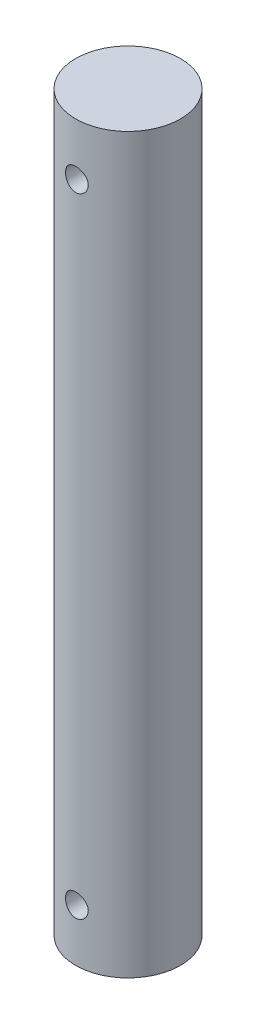
ISO-10303-21;
HEADER;
FILE_DESCRIPTION(('STEP AP214'),'2;1');
FILE_NAME('part.step','',(''),(''),'','','');
FILE_SCHEMA(('AUTOMOTIVE_DESIGN { 1 0 10303 214 1 1 1 1 }'));
ENDSEC;
DATA;
#1=APPLICATION_CONTEXT('core data for automotive mechanical design processes');
#2=APPLICATION_PROTOCOL_DEFINITION('international standard','automotive_design',2000,#1);
#3=PRODUCT_CONTEXT('',#1,'mechanical');
#4=PRODUCT('Part','Part','',(#3));
#5=PRODUCT_RELATED_PRODUCT_CATEGORY('part','',(#4));
#6=PRODUCT_DEFINITION_FORMATION('','',#4);
#7=PRODUCT_DEFINITION_CONTEXT('part definition',#1,'design');
#8=PRODUCT_DEFINITION('design','',#6,#7);
#9=PRODUCT_DEFINITION_SHAPE('','',#8);
#10=(LENGTH_UNIT() NAMED_UNIT(*) SI_UNIT(.MILLI.,.METRE.));
#11=(NAMED_UNIT(*) PLANE_ANGLE_UNIT() SI_UNIT($,.RADIAN.));
#12=(NAMED_UNIT(*) SI_UNIT($,.STERADIAN.) SOLID_ANGLE_UNIT());
#13=UNCERTAINTY_MEASURE_WITH_UNIT(LENGTH_MEASURE(1.E-05),#10,'distance_accuracy_value','');
#14=(GEOMETRIC_REPRESENTATION_CONTEXT(3) GLOBAL_UNCERTAINTY_ASSIGNED_CONTEXT((#13)) GLOBAL_UNIT_ASSIGNED_CONTEXT((#10,
#11,#12)) REPRESENTATION_CONTEXT('',''));
#15=CARTESIAN_POINT('',(0.,0.,0.));
#16=DIRECTION('',(0.,0.,1.));
#17=DIRECTION('',(1.,0.,0.));
#18=AXIS2_PLACEMENT_3D('',#15,#16,#17);
#19=CARTESIAN_POINT('',(0.,0.,0.));
#20=DIRECTION('',(0.,-1.,0.));
#21=DIRECTION('',(0.,0.,-1.));
#22=AXIS2_PLACEMENT_3D('',#19,#20,#21);
#23=CYLINDRICAL_SURFACE('',#22,15.);
#24=CARTESIAN_POINT('',(0.,198.25,-15.));
#25=CARTESIAN_POINT('',(-0.180295908049448,198.249993784621,-14.9999966693057));
#26=CARTESIAN_POINT('',(-0.360667307049298,198.234946290807,-14.9967162684783));
#27=CARTESIAN_POINT('',(-0.716289565823278,198.175214701707,-14.9839468995945));
#28=CARTESIAN_POINT('',(-0.891536624010413,198.130509158674,-14.9744534385199));
#29=CARTESIAN_POINT('',(-1.23171906209388,198.012925168686,-14.9503153207334));
#30=CARTESIAN_POINT('',(-1.39666490753509,197.940075873709,-14.9356759956412));
#31=CARTESIAN_POINT('',(-1.71198631079314,197.768364158581,-14.9028274454145));
#32=CARTESIAN_POINT('',(-1.86236230084291,197.669502510443,-14.8846183262309));
#33=CARTESIAN_POINT('',(-2.14665208154906,197.446923003415,-14.8463051127686));
#34=CARTESIAN_POINT('',(-2.28030331937103,197.322873751652,-14.8261778835102));
#35=CARTESIAN_POINT('',(-2.52507351676009,197.054151889517,-14.7864605245003));
#36=CARTESIAN_POINT('',(-2.63619049708834,196.909477469485,-14.7668704420584));
#37=CARTESIAN_POINT('',(-2.83389172171801,196.601676791658,-14.7302175916099));
#38=CARTESIAN_POINT('',(-2.92019732981498,196.438367718132,-14.7131844826828));
#39=CARTESIAN_POINT('',(-3.06403885746017,196.099134450798,-14.6839058035849));
#40=CARTESIAN_POINT('',(-3.12157814775265,195.92321173778,-14.6716596725283));
#41=CARTESIAN_POINT('',(-3.20538774577177,195.566590450354,-14.6535769412305));
#42=CARTESIAN_POINT('',(-3.23212243576156,195.386005934341,-14.6476452571684));
#43=CARTESIAN_POINT('',(-3.25500769755932,195.022824880646,-14.6425773884666));
#44=CARTESIAN_POINT('',(-3.25116195572919,194.840228588125,-14.6434403847524));
#45=CARTESIAN_POINT('',(-3.21336942802685,194.481653251494,-14.6517782488981));
#46=CARTESIAN_POINT('',(-3.17996128945998,194.305614268404,-14.659134793886));
#47=CARTESIAN_POINT('',(-3.08484532446007,193.961700506059,-14.6794438722465));
#48=CARTESIAN_POINT('',(-3.02313593703792,193.793826177702,-14.6923967142872));
#49=CARTESIAN_POINT('',(-2.87267234160868,193.469488465532,-14.7225560243955));
#50=CARTESIAN_POINT('',(-2.78371029025397,193.313124649328,-14.739794983375));
#51=CARTESIAN_POINT('',(-2.58141287347627,193.017344939241,-14.7765640984072));
#52=CARTESIAN_POINT('',(-2.4680742447044,192.877931318434,-14.7960945610695));
#53=CARTESIAN_POINT('',(-2.21738589401456,192.616907475027,-14.835754332158));
#54=CARTESIAN_POINT('',(-2.07957794577936,192.495737503128,-14.85588755679));
#55=CARTESIAN_POINT('',(-1.7853706879587,192.278157632006,-14.8941069317091));
#56=CARTESIAN_POINT('',(-1.6289710538129,192.181748165128,-14.9121930462485));
#57=CARTESIAN_POINT('',(-1.3014881897179,192.016320368726,-14.9443373716602));
#58=CARTESIAN_POINT('',(-1.13037536900717,191.947358886443,-14.9583872064739));
#59=CARTESIAN_POINT('',(-0.778618718560527,191.839289234188,-14.9808135442155));
#60=CARTESIAN_POINT('',(-0.597976252163955,191.800176806238,-14.9891908563114));
#61=CARTESIAN_POINT('',(-0.2360652110289,191.753553913845,-14.999213361495));
#62=CARTESIAN_POINT('',(-0.0548775718096582,191.745441938139,-15.0009866764124));
#63=CARTESIAN_POINT('',(0.306263892778617,191.759421041123,-14.9979600537354));
#64=CARTESIAN_POINT('',(0.486217799382512,191.781510111658,-14.9931605531864));
#65=CARTESIAN_POINT('',(0.837796559168634,191.854765383555,-14.9776083561987));
#66=CARTESIAN_POINT('',(1.00949009057104,191.905616871482,-14.9669201255134));
#67=CARTESIAN_POINT('',(1.34191087470412,192.034604790844,-14.9407864650998));
#68=CARTESIAN_POINT('',(1.50263720396353,192.112743516564,-14.9253406353698));
#69=CARTESIAN_POINT('',(1.81105407007216,192.295346575048,-14.8910886543747));
#70=CARTESIAN_POINT('',(1.9585297850952,192.400165276922,-14.8722383494472));
#71=CARTESIAN_POINT('',(2.23401442977502,192.632685338536,-14.8333599953618));
#72=CARTESIAN_POINT('',(2.36202087803886,192.760389610573,-14.8133317965295));
#73=CARTESIAN_POINT('',(2.59730506366785,193.037813561719,-14.7739136304381));
#74=CARTESIAN_POINT('',(2.70416667406636,193.187889197169,-14.7545417229379));
#75=CARTESIAN_POINT('',(2.89117048723926,193.504210856978,-14.7190430959262));
#76=CARTESIAN_POINT('',(2.97131383846081,193.670456185909,-14.7029162369426));
#77=CARTESIAN_POINT('',(3.1020701832625,194.013511070582,-14.6758857522881));
#78=CARTESIAN_POINT('',(3.15284800405868,194.190255397078,-14.6649530352252));
#79=CARTESIAN_POINT('',(3.22391689783528,194.550034561049,-14.6494951003857));
#80=CARTESIAN_POINT('',(3.24421274100597,194.733068409678,-14.6449688800489));
#81=CARTESIAN_POINT('',(3.25354151060672,195.096037370382,-14.6428987441684));
#82=CARTESIAN_POINT('',(3.24323395356437,195.275955006757,-14.6452075281965));
#83=CARTESIAN_POINT('',(3.19312076993412,195.631424667548,-14.6562145868373));
#84=CARTESIAN_POINT('',(3.1533154775375,195.806976741401,-14.6649127890618));
#85=CARTESIAN_POINT('',(3.04565266388731,196.148219999221,-14.6876474775607));
#86=CARTESIAN_POINT('',(2.97788940663082,196.313942198673,-14.7016660130169));
#87=CARTESIAN_POINT('',(2.81631583767424,196.631764098396,-14.7334692103237));
#88=CARTESIAN_POINT('',(2.72250287117638,196.783862408127,-14.7512542559859));
#89=CARTESIAN_POINT('',(2.50929797419179,197.073373956119,-14.7890277865734));
#90=CARTESIAN_POINT('',(2.38943530184154,197.210435799835,-14.809052999583));
#91=CARTESIAN_POINT('',(2.12848952985281,197.462716799502,-14.8488018655154));
#92=CARTESIAN_POINT('',(1.98740153607882,197.577930903915,-14.8685254477296));
#93=CARTESIAN_POINT('',(1.68585522677997,197.78464218421,-14.905745119116));
#94=CARTESIAN_POINT('',(1.52517402330616,197.875820178016,-14.9232097999439));
#95=CARTESIAN_POINT('',(1.19042388194525,198.029730439531,-14.9536295276971));
#96=CARTESIAN_POINT('',(1.01636641468493,198.092486768376,-14.9665883869811));
#97=CARTESIAN_POINT('',(0.701757838379086,198.176476440887,-14.9842005952921));
#98=CARTESIAN_POINT('',(0.562919481911555,198.203995568961,-14.9900889074932));
#99=CARTESIAN_POINT('',(0.282736154267477,198.240759394974,-14.9979898329921));
#100=CARTESIAN_POINT('',(0.141391290518709,198.250004874212,-15.0000026119903));
#101=CARTESIAN_POINT('',(0.,198.25,-15.));
#102=B_SPLINE_CURVE_WITH_KNOTS('',3,(#24,#25,#26,#27,#28,#29,#30,#31,#32,#33,#34,#35,#36,#37,
#38,#39,#40,#41,#42,#43,#44,#45,#46,#47,#48,#49,#50,#51,#52,#53,#54,#55,#56,#57,#58,#59,#60,#61,
#62,#63,#64,#65,#66,#67,#68,#69,#70,#71,#72,#73,#74,#75,#76,#77,#78,#79,#80,#81,#82,#83,#84,#85,
#86,#87,#88,#89,#90,#91,#92,#93,#94,#95,#96,#97,#98,#99,#100,#101),.UNSPECIFIED.,.T.,.F.,(4,2,2,
2,2,2,2,2,2,2,2,2,2,2,2,2,2,2,2,2,2,2,2,2,2,2,2,2,2,2,2,2,2,2,2,2,2,2,4),(0.,0.540370209495572,
1.08113162395274,1.62133440005141,2.16152114545112,2.7093386000599,3.25720414999318,
3.81100133249794,4.36473360761809,4.91000435837714,5.45520937968999,5.99068035786525,
6.5261808741332,7.06587160249394,7.60563462552349,8.15684427994945,8.70806355841292,
9.26041859404906,9.81269482130974,10.3541989908452,10.8956671559495,11.4313222043121,
11.9670223009176,12.5102471881152,13.0535412523857,13.606647537556,14.1597300451566,
14.7096772201886,15.2595383238331,15.7976362931293,16.3357281661981,16.8720204277009,
17.408367364301,17.9553599003686,18.5024787558608,19.0565335795928,19.6101184722971,
20.033904619159,20.4576726464261),.UNSPECIFIED.);
#103=CARTESIAN_POINT('',(0.,198.25,-15.));
#104=VERTEX_POINT('',#103);
#105=EDGE_CURVE('E50',#104,#104,#102,.T.);
#106=ORIENTED_EDGE('',*,*,#105,.T.);
#107=EDGE_LOOP('',(#106));
#108=FACE_BOUND('',#107,.T.);
#109=CARTESIAN_POINT('',(3.25,195.,14.6436846456075));
#110=CARTESIAN_POINT('',(3.24999374418569,194.819760088784,14.6436882875398));
#111=CARTESIAN_POINT('',(3.23495527856303,194.63944458552,14.6470485721587));
#112=CARTESIAN_POINT('',(3.1752627965198,194.283938357536,14.6601025036353));
#113=CARTESIAN_POINT('',(3.13058710870242,194.108751480931,14.6698007849001));
#114=CARTESIAN_POINT('',(3.01309038926967,193.768696553366,14.6943819358565));
#115=CARTESIAN_POINT('',(2.94029990891101,193.603817526453,14.7092591760476));
#116=CARTESIAN_POINT('',(2.76872687046993,193.288608945559,14.7425151888116));
#117=CARTESIAN_POINT('',(2.66994495139821,193.138279034006,14.7608938752969));
#118=CARTESIAN_POINT('',(2.44744749965638,192.853940839162,14.7994223656265));
#119=CARTESIAN_POINT('',(2.32338265230344,192.72020887168,14.8195944640893));
#120=CARTESIAN_POINT('',(2.05459524161824,192.475281833832,14.8592415907077));
#121=CARTESIAN_POINT('',(1.90987109259749,192.364088494987,14.8787165652125));
#122=CARTESIAN_POINT('',(1.60202327034842,192.16630444832,14.9150176708326));
#123=CARTESIAN_POINT('',(1.4387253220784,192.079979142488,14.9318144302608));
#124=CARTESIAN_POINT('',(1.09951606220902,191.936098174415,14.9606148904119));
#125=CARTESIAN_POINT('',(0.923606141450511,191.878539345388,14.9726191186962));
#126=CARTESIAN_POINT('',(0.567038811589573,191.794693257701,14.9903244226033));
#127=CARTESIAN_POINT('',(0.386496095207174,191.767938466318,14.9961196396371));
#128=CARTESIAN_POINT('',(0.0233979815583357,191.744998496565,15.0010800104915));
#129=CARTESIAN_POINT('',(-0.159157187294291,191.748809883883,15.0002459091595));
#130=CARTESIAN_POINT('',(-0.517876282975206,191.786545141564,14.9921136856068));
#131=CARTESIAN_POINT('',(-0.69409603036072,191.819965108907,14.9849237369129));
#132=CARTESIAN_POINT('',(-1.03836507975621,191.91516629691,14.9650107956937));
#133=CARTESIAN_POINT('',(-1.20641401655309,191.976948784013,14.9522875560976));
#134=CARTESIAN_POINT('',(-1.53097439172053,192.127569352293,14.9225631793824));
#135=CARTESIAN_POINT('',(-1.68739397454787,192.216599169469,14.9055318792963));
#136=CARTESIAN_POINT('',(-1.98325708864248,192.419044319751,14.8690599867316));
#137=CARTESIAN_POINT('',(-2.12269834391616,192.532462916618,14.8496190719406));
#138=CARTESIAN_POINT('',(-2.38364280420854,192.78321187461,14.8099982184546));
#139=CARTESIAN_POINT('',(-2.50472152387351,192.920983259141,14.7898112954025));
#140=CARTESIAN_POINT('',(-2.72213417758256,193.215083579408,14.751346087027));
#141=CARTESIAN_POINT('',(-2.81846746606027,193.371412999135,14.7330678515052));
#142=CARTESIAN_POINT('',(-2.98383849279335,193.698869301842,14.7004716199645));
#143=CARTESIAN_POINT('',(-3.05279732493626,193.870037253251,14.6861651074568));
#144=CARTESIAN_POINT('',(-3.16084516369863,194.22191478425,14.6632922486876));
#145=CARTESIAN_POINT('',(-3.19993881050222,194.402622876913,14.6547250107347));
#146=CARTESIAN_POINT('',(-3.24649087294647,194.764575930912,14.6444822196297));
#147=CARTESIAN_POINT('',(-3.25456679164568,194.945737759039,14.6426721647475));
#148=CARTESIAN_POINT('',(-3.24052481285367,195.30681926365,14.6457860597559));
#149=CARTESIAN_POINT('',(-3.21840894767304,195.486739022922,14.6507095563884));
#150=CARTESIAN_POINT('',(-3.14514656813775,195.838087520737,14.6666089084925));
#151=CARTESIAN_POINT('',(-3.09433900332005,196.009590430739,14.6775140573003));
#152=CARTESIAN_POINT('',(-2.96550194274915,196.341649180575,14.7040843972367));
#153=CARTESIAN_POINT('',(-2.88746988175918,196.502203987116,14.7197500369061));
#154=CARTESIAN_POINT('',(-2.70503415943233,196.810484620301,14.7543725034408));
#155=CARTESIAN_POINT('',(-2.60024942185828,196.95797963734,14.7733755324212));
#156=CARTESIAN_POINT('',(-2.36778249296566,197.233518769565,14.8124092112065));
#157=CARTESIAN_POINT('',(-2.24009751407035,197.361560513254,14.8324399859035));
#158=CARTESIAN_POINT('',(-1.96266282739553,197.596948950887,14.8717147831235));
#159=CARTESIAN_POINT('',(-1.81255277825355,197.703875041457,14.8909377595947));
#160=CARTESIAN_POINT('',(-1.49614237446866,197.890991926299,14.9260462662687));
#161=CARTESIAN_POINT('',(-1.3298427686606,197.971183956374,14.941931950728));
#162=CARTESIAN_POINT('',(-0.986799845054551,198.101967485345,14.9684871127288));
#163=CARTESIAN_POINT('',(-0.81012987618583,198.152744455288,14.9791892026722));
#164=CARTESIAN_POINT('',(-0.450509790668171,198.223836731634,14.9943122217838));
#165=CARTESIAN_POINT('',(-0.267560572750787,198.244156378865,14.9987340460212));
#166=CARTESIAN_POINT('',(0.0954291307323043,198.25356510789,15.0007723542807));
#167=CARTESIAN_POINT('',(0.275452845637323,198.243282654458,14.9985257872796));
#168=CARTESIAN_POINT('',(0.631141434245107,198.193182742926,14.9877725306642));
#169=CARTESIAN_POINT('',(0.806806383405669,198.153365796489,14.9792659494998));
#170=CARTESIAN_POINT('',(1.14831560036396,198.045625919775,14.9569578961947));
#171=CARTESIAN_POINT('',(1.31418864994873,197.977790584521,14.9431729357756));
#172=CARTESIAN_POINT('',(1.63228292912195,197.816025535732,14.9117815148407));
#173=CARTESIAN_POINT('',(1.78450285868517,197.722093340785,14.8941746909588));
#174=CARTESIAN_POINT('',(2.07404033052225,197.508743638425,14.8566513945941));
#175=CARTESIAN_POINT('',(2.21102679757487,197.388883287877,14.8366979551395));
#176=CARTESIAN_POINT('',(2.46315681458146,197.127974863729,14.7969317175724));
#177=CARTESIAN_POINT('',(2.57829510398268,196.986921701984,14.7771189544342));
#178=CARTESIAN_POINT('',(2.78490749954038,196.685415910371,14.7395892040315));
#179=CARTESIAN_POINT('',(2.87605278058932,196.524733903933,14.721902979916));
#180=CARTESIAN_POINT('',(3.02990167278536,196.189985616612,14.691014282851));
#181=CARTESIAN_POINT('',(3.09262955452639,196.015930906209,14.6778079861381));
#182=CARTESIAN_POINT('',(3.17655313266695,195.7013942379,14.6598384420898));
#183=CARTESIAN_POINT('',(3.20404329920648,195.562629072153,14.6538206642654));
#184=CARTESIAN_POINT('',(3.24076875699929,195.282591349023,14.6457424311338));
#185=CARTESIAN_POINT('',(3.25000490493393,195.141318909622,14.6436817901139));
#186=CARTESIAN_POINT('',(3.25,195.,14.6436846456075));
#187=B_SPLINE_CURVE_WITH_KNOTS('',3,(#109,#110,#111,#112,#113,#114,#115,#116,#117,#118,#119,
#120,#121,#122,#123,#124,#125,#126,#127,#128,#129,#130,#131,#132,#133,#134,#135,#136,#137,#138,
#139,#140,#141,#142,#143,#144,#145,#146,#147,#148,#149,#150,#151,#152,#153,#154,#155,#156,#157,
#158,#159,#160,#161,#162,#163,#164,#165,#166,#167,#168,#169,#170,#171,#172,#173,#174,#175,#176,
#177,#178,#179,#180,#181,#182,#183,#184,#185,#186),.UNSPECIFIED.,.T.,.F.,(4,2,2,2,2,2,2,2,2,2,2,
2,2,2,2,2,2,2,2,2,2,2,2,2,2,2,2,2,2,2,2,2,2,2,2,2,2,2,4),(0.,0.540201867279167,1.08079917823533,
1.62081068828917,2.16080892316839,2.70884661020496,3.25692638408379,3.81065542264333,
4.36432348994259,4.90947255414443,5.45456036813802,5.99054590788528,6.5265553827517,
7.06642696356627,7.60637083622473,8.15734142868398,8.70832639357308,9.26088822158566,
9.81336418003639,10.3547826108844,10.8961645988328,11.4312808842156,11.9664476047232,
12.5097099886453,13.0530385471842,13.6062886945075,14.1595132638403,14.7092105093708,
15.258829403681,15.7972393725394,16.3356400140747,16.8723700217382,17.409151081722,
17.9559483293249,18.5028770668873,19.0569514102052,19.6105516361109,20.0341222057674,
20.4576728963144),.UNSPECIFIED.);
#188=CARTESIAN_POINT('',(3.25,195.,14.6436846456075));
#189=VERTEX_POINT('',#188);
#190=EDGE_CURVE('E54',#189,#189,#187,.T.);
#191=ORIENTED_EDGE('',*,*,#190,.T.);
#192=EDGE_LOOP('',(#191));
#193=FACE_BOUND('',#192,.T.);
#194=CARTESIAN_POINT('',(0.,0.,0.));
#195=DIRECTION('',(0.,-1.,0.));
#196=DIRECTION('',(0.,0.,-1.));
#197=AXIS2_PLACEMENT_3D('',#194,#195,#196);
#198=CIRCLE('',#197,15.);
#199=CARTESIAN_POINT('',(0.,0.,-15.));
#200=VERTEX_POINT('',#199);
#201=EDGE_CURVE('E84',#200,#200,#198,.T.);
#202=ORIENTED_EDGE('',*,*,#201,.F.);
#203=EDGE_LOOP('',(#202));
#204=FACE_BOUND('',#203,.T.);
#205=CARTESIAN_POINT('',(0.,210.,0.));
#206=DIRECTION('',(0.,-1.,0.));
#207=DIRECTION('',(0.,0.,-1.));
#208=AXIS2_PLACEMENT_3D('',#205,#206,#207);
#209=CIRCLE('',#208,15.);
#210=CARTESIAN_POINT('',(0.,210.,-15.));
#211=VERTEX_POINT('',#210);
#212=EDGE_CURVE('E81',#211,#211,#209,.T.);
#213=ORIENTED_EDGE('',*,*,#212,.T.);
#214=EDGE_LOOP('',(#213));
#215=FACE_BOUND('',#214,.T.);
#216=CARTESIAN_POINT('',(3.25,15.,14.6436846456075));
#217=CARTESIAN_POINT('',(3.24999374418569,15.1802399112158,14.6436882875398));
#218=CARTESIAN_POINT('',(3.23495527856303,15.3605554144799,14.6470485721587));
#219=CARTESIAN_POINT('',(3.1752627965198,15.7160616424636,14.6601025036353));
#220=CARTESIAN_POINT('',(3.13058710870242,15.8912485190693,14.6698007849001));
#221=CARTESIAN_POINT('',(3.01309038926967,16.2313034466338,14.6943819358565));
#222=CARTESIAN_POINT('',(2.940299908911,16.3961824735471,14.7092591760476));
#223=CARTESIAN_POINT('',(2.76872687046992,16.7113910544414,14.7425151888116));
#224=CARTESIAN_POINT('',(2.6699449513982,16.8617209659944,14.7608938752969));
#225=CARTESIAN_POINT('',(2.44744749965638,17.1460591608377,14.7994223656265));
#226=CARTESIAN_POINT('',(2.32338265230344,17.2797911283198,14.8195944640893));
#227=CARTESIAN_POINT('',(2.05459524161824,17.5247181661683,14.8592415907077));
#228=CARTESIAN_POINT('',(1.9098710925975,17.6359115050131,14.8787165652125));
#229=CARTESIAN_POINT('',(1.60202327034843,17.8336955516798,14.9150176708326));
#230=CARTESIAN_POINT('',(1.43872532207842,17.9200208575121,14.9318144302608));
#231=CARTESIAN_POINT('',(1.09951606220903,18.0639018255847,14.9606148904119));
#232=CARTESIAN_POINT('',(0.923606141450512,18.1214606546119,14.9726191186962));
#233=CARTESIAN_POINT('',(0.56703881158957,18.2053067422992,14.9903244226033));
#234=CARTESIAN_POINT('',(0.386496095207174,18.2320615336815,14.9961196396371));
#235=CARTESIAN_POINT('',(0.023397981558342,18.2550015034354,15.0010800104915));
#236=CARTESIAN_POINT('',(-0.159157187294282,18.2511901161174,15.0002459091595));
#237=CARTESIAN_POINT('',(-0.517876282975195,18.213454858436,14.9921136856068));
#238=CARTESIAN_POINT('',(-0.694096030360709,18.1800348910935,14.9849237369129));
#239=CARTESIAN_POINT('',(-1.0383650797562,18.0848337030898,14.9650107956937));
#240=CARTESIAN_POINT('',(-1.20641401655308,18.0230512159872,14.9522875560976));
#241=CARTESIAN_POINT('',(-1.53097439172052,17.8724306477073,14.9225631793824));
#242=CARTESIAN_POINT('',(-1.68739397454786,17.7834008305314,14.9055318792963));
#243=CARTESIAN_POINT('',(-1.98325708864247,17.5809556802493,14.8690599867316));
#244=CARTESIAN_POINT('',(-2.12269834391615,17.4675370833815,14.8496190719406));
#245=CARTESIAN_POINT('',(-2.38364280420854,17.2167881253904,14.8099982184546));
#246=CARTESIAN_POINT('',(-2.50472152387351,17.0790167408589,14.7898112954025));
#247=CARTESIAN_POINT('',(-2.72213417758256,16.784916420592,14.751346087027));
#248=CARTESIAN_POINT('',(-2.81846746606027,16.6285870008645,14.7330678515052));
#249=CARTESIAN_POINT('',(-2.98383849279334,16.301130698158,14.7004716199645));
#250=CARTESIAN_POINT('',(-3.05279732493625,16.1299627467494,14.6861651074568));
#251=CARTESIAN_POINT('',(-3.16084516369863,15.7780852157499,14.6632922486876));
#252=CARTESIAN_POINT('',(-3.19993881050222,15.597377123087,14.6547250107347));
#253=CARTESIAN_POINT('',(-3.24649087294647,15.2354240690877,14.6444822196297));
#254=CARTESIAN_POINT('',(-3.25456679164568,15.0542622409606,14.6426721647475));
#255=CARTESIAN_POINT('',(-3.24052481285367,14.6931807363498,14.6457860597559));
#256=CARTESIAN_POINT('',(-3.21840894767304,14.5132609770777,14.6507095563884));
#257=CARTESIAN_POINT('',(-3.14514656813775,14.1619124792627,14.6666089084925));
#258=CARTESIAN_POINT('',(-3.09433900332005,13.9904095692611,14.6775140573003));
#259=CARTESIAN_POINT('',(-2.96550194274914,13.6583508194252,14.7040843972367));
#260=CARTESIAN_POINT('',(-2.88746988175917,13.4977960128843,14.7197500369061));
#261=CARTESIAN_POINT('',(-2.70503415943233,13.1895153796987,14.7543725034408));
#262=CARTESIAN_POINT('',(-2.60024942185828,13.0420203626596,14.7733755324212));
#263=CARTESIAN_POINT('',(-2.36778249296566,12.7664812304348,14.8124092112065));
#264=CARTESIAN_POINT('',(-2.24009751407034,12.6384394867457,14.8324399859035));
#265=CARTESIAN_POINT('',(-1.96266282739552,12.4030510491133,14.8717147831235));
#266=CARTESIAN_POINT('',(-1.81255277825353,12.2961249585425,14.8909377595947));
#267=CARTESIAN_POINT('',(-1.49614237446865,12.1090080737008,14.9260462662687));
#268=CARTESIAN_POINT('',(-1.32984276866059,12.0288160436259,14.941931950728));
#269=CARTESIAN_POINT('',(-0.986799845054544,11.8980325146554,14.9684871127288));
#270=CARTESIAN_POINT('',(-0.810129876185827,11.8472555447121,14.9791892026722));
#271=CARTESIAN_POINT('',(-0.45050979066817,11.776163268366,14.9943122217838));
#272=CARTESIAN_POINT('',(-0.267560572750783,11.7558436211347,14.9987340460212));
#273=CARTESIAN_POINT('',(0.0954291307323083,11.74643489211,15.0007723542807));
#274=CARTESIAN_POINT('',(0.275452845637325,11.7567173455419,14.9985257872796));
#275=CARTESIAN_POINT('',(0.631141434245105,11.8068172570736,14.9877725306642));
#276=CARTESIAN_POINT('',(0.806806383405667,11.846634203511,14.9792659494998));
#277=CARTESIAN_POINT('',(1.14831560036396,11.9543740802247,14.9569578961947));
#278=CARTESIAN_POINT('',(1.31418864994873,12.0222094154794,14.9431729357756));
#279=CARTESIAN_POINT('',(1.63228292912195,12.1839744642678,14.9117815148407));
#280=CARTESIAN_POINT('',(1.78450285868516,12.2779066592151,14.8941746909588));
#281=CARTESIAN_POINT('',(2.07404033052224,12.4912563615745,14.8566513945941));
#282=CARTESIAN_POINT('',(2.21102679757485,12.6111167121226,14.8366979551395));
#283=CARTESIAN_POINT('',(2.46315681458144,12.8720251362713,14.7969317175724));
#284=CARTESIAN_POINT('',(2.57829510398266,13.0130782980155,14.7771189544342));
#285=CARTESIAN_POINT('',(2.78490749954037,13.3145840896293,14.7395892040315));
#286=CARTESIAN_POINT('',(2.87605278058932,13.475266096067,14.721902979916));
#287=CARTESIAN_POINT('',(3.02990167278536,13.8100143833876,14.691014282851));
#288=CARTESIAN_POINT('',(3.09262955452639,13.9840690937907,14.6778079861381));
#289=CARTESIAN_POINT('',(3.17655313266695,14.2986057621,14.6598384420898));
#290=CARTESIAN_POINT('',(3.20404329920648,14.4373709278468,14.6538206642654));
#291=CARTESIAN_POINT('',(3.24076875699929,14.7174086509774,14.6457424311338));
#292=CARTESIAN_POINT('',(3.25000490493393,14.8586810903781,14.6436817901139));
#293=CARTESIAN_POINT('',(3.25,15.,14.6436846456075));
#294=B_SPLINE_CURVE_WITH_KNOTS('',3,(#216,#217,#218,#219,#220,#221,#222,#223,#224,#225,#226,
#227,#228,#229,#230,#231,#232,#233,#234,#235,#236,#237,#238,#239,#240,#241,#242,#243,#244,#245,
#246,#247,#248,#249,#250,#251,#252,#253,#254,#255,#256,#257,#258,#259,#260,#261,#262,#263,#264,
#265,#266,#267,#268,#269,#270,#271,#272,#273,#274,#275,#276,#277,#278,#279,#280,#281,#282,#283,
#284,#285,#286,#287,#288,#289,#290,#291,#292,#293),.UNSPECIFIED.,.T.,.F.,(4,2,2,2,2,2,2,2,2,2,2,
2,2,2,2,2,2,2,2,2,2,2,2,2,2,2,2,2,2,2,2,2,2,2,2,2,2,2,4),(0.,0.54020186727917,1.08079917823533,
1.62081068828918,2.1608089231684,2.70884661020495,3.25692638408377,3.81065542264331,
4.36432348994259,4.90947255414443,5.45456036813801,5.99054590788526,6.5265553827517,
7.06642696356626,7.60637083622471,8.15734142868398,8.70832639357308,9.26088822158562,
9.81336418003638,10.3547826108844,10.8961645988328,11.4312808842156,11.9664476047232,
12.5097099886454,13.0530385471842,13.6062886945075,14.1595132638403,14.7092105093708,
15.258829403681,15.7972393725394,16.3356400140747,16.8723700217382,17.409151081722,
17.9559483293249,18.5028770668873,19.0569514102052,19.6105516361109,20.0341222057674,
20.4576728963144),.UNSPECIFIED.);
#295=CARTESIAN_POINT('',(3.25,15.,14.6436846456075));
#296=VERTEX_POINT('',#295);
#297=EDGE_CURVE('E46',#296,#296,#294,.T.);
#298=ORIENTED_EDGE('',*,*,#297,.F.);
#299=EDGE_LOOP('',(#298));
#300=FACE_BOUND('',#299,.T.);
#301=CARTESIAN_POINT('',(0.,18.25,-15.));
#302=CARTESIAN_POINT('',(0.180295908049449,18.2499937846208,-14.9999966693057));
#303=CARTESIAN_POINT('',(0.360667307049297,18.234946290807,-14.9967162684783));
#304=CARTESIAN_POINT('',(0.716289565823279,18.1752147017072,-14.9839468995945));
#305=CARTESIAN_POINT('',(0.891536624010416,18.1305091586736,-14.9744534385199));
#306=CARTESIAN_POINT('',(1.23171906209388,18.0129251686857,-14.9503153207334));
#307=CARTESIAN_POINT('',(1.39666490753509,17.9400758737089,-14.9356759956412));
#308=CARTESIAN_POINT('',(1.71198631079314,17.7683641585813,-14.9028274454145));
#309=CARTESIAN_POINT('',(1.8623623008429,17.669502510443,-14.8846183262309));
#310=CARTESIAN_POINT('',(2.14665208154906,17.4469230034145,-14.8463051127686));
#311=CARTESIAN_POINT('',(2.28030331937104,17.3228737516518,-14.8261778835102));
#312=CARTESIAN_POINT('',(2.52507351676009,17.0541518895168,-14.7864605245003));
#313=CARTESIAN_POINT('',(2.63619049708833,16.9094774694847,-14.7668704420584));
#314=CARTESIAN_POINT('',(2.83389172171801,16.6016767916576,-14.7302175916099));
#315=CARTESIAN_POINT('',(2.92019732981498,16.4383677181318,-14.7131844826828));
#316=CARTESIAN_POINT('',(3.06403885746017,16.0991344507983,-14.6839058035849));
#317=CARTESIAN_POINT('',(3.12157814775265,15.9232117377798,-14.6716596725283));
#318=CARTESIAN_POINT('',(3.20538774577176,15.5665904503538,-14.6535769412305));
#319=CARTESIAN_POINT('',(3.23212243576155,15.3860059343409,-14.6476452571684));
#320=CARTESIAN_POINT('',(3.25500769755931,15.0228248806455,-14.6425773884666));
#321=CARTESIAN_POINT('',(3.25116195572918,14.8402285881253,-14.6434403847524));
#322=CARTESIAN_POINT('',(3.21336942802683,14.4816532514944,-14.6517782488981));
#323=CARTESIAN_POINT('',(3.17996128945996,14.3056142684039,-14.659134793886));
#324=CARTESIAN_POINT('',(3.08484532446005,13.9617005060594,-14.6794438722465));
#325=CARTESIAN_POINT('',(3.02313593703789,13.7938261777017,-14.6923967142872));
#326=CARTESIAN_POINT('',(2.87267234160865,13.469488465532,-14.7225560243955));
#327=CARTESIAN_POINT('',(2.78371029025394,13.3131246493284,-14.739794983375));
#328=CARTESIAN_POINT('',(2.58141287347624,13.017344939241,-14.7765640984072));
#329=CARTESIAN_POINT('',(2.46807424470437,12.8779313184344,-14.7960945610695));
#330=CARTESIAN_POINT('',(2.21738589401454,12.6169074750266,-14.835754332158));
#331=CARTESIAN_POINT('',(2.07957794577934,12.4957375031276,-14.85588755679));
#332=CARTESIAN_POINT('',(1.78537068795868,12.2781576320062,-14.8941069317091));
#333=CARTESIAN_POINT('',(1.62897105381287,12.181748165128,-14.9121930462485));
#334=CARTESIAN_POINT('',(1.30148818971786,12.0163203687261,-14.9443373716602));
#335=CARTESIAN_POINT('',(1.13037536900714,11.947358886443,-14.9583872064739));
#336=CARTESIAN_POINT('',(0.7786187185605,11.8392892341877,-14.9808135442155));
#337=CARTESIAN_POINT('',(0.597976252163933,11.8001768062376,-14.9891908563114));
#338=CARTESIAN_POINT('',(0.236065211028883,11.753553913845,-14.999213361495));
#339=CARTESIAN_POINT('',(0.054877571809641,11.7454419381389,-15.0009866764124));
#340=CARTESIAN_POINT('',(-0.306263892778634,11.7594210411229,-14.9979600537354));
#341=CARTESIAN_POINT('',(-0.486217799382528,11.7815101116578,-14.9931605531864));
#342=CARTESIAN_POINT('',(-0.837796559168651,11.8547653835552,-14.9776083561987));
#343=CARTESIAN_POINT('',(-1.00949009057105,11.9056168714823,-14.9669201255134));
#344=CARTESIAN_POINT('',(-1.34191087470414,12.0346047908436,-14.9407864650998));
#345=CARTESIAN_POINT('',(-1.50263720396355,12.1127435165642,-14.9253406353698));
#346=CARTESIAN_POINT('',(-1.81105407007217,12.2953465750481,-14.8910886543747));
#347=CARTESIAN_POINT('',(-1.95852978509521,12.4001652769219,-14.8722383494472));
#348=CARTESIAN_POINT('',(-2.23401442977503,12.632685338536,-14.8333599953618));
#349=CARTESIAN_POINT('',(-2.36202087803887,12.760389610573,-14.8133317965295));
#350=CARTESIAN_POINT('',(-2.59730506366786,13.037813561719,-14.7739136304381));
#351=CARTESIAN_POINT('',(-2.70416667406637,13.1878891971685,-14.7545417229379));
#352=CARTESIAN_POINT('',(-2.89117048723927,13.5042108569779,-14.7190430959262));
#353=CARTESIAN_POINT('',(-2.97131383846082,13.6704561859092,-14.7029162369426));
#354=CARTESIAN_POINT('',(-3.10207018326251,14.0135110705824,-14.6758857522881));
#355=CARTESIAN_POINT('',(-3.15284800405869,14.1902553970777,-14.6649530352252));
#356=CARTESIAN_POINT('',(-3.22391689783529,14.5500345610491,-14.6494951003857));
#357=CARTESIAN_POINT('',(-3.24421274100598,14.7330684096777,-14.6449688800489));
#358=CARTESIAN_POINT('',(-3.25354151060673,15.0960373703822,-14.6428987441684));
#359=CARTESIAN_POINT('',(-3.24323395356438,15.2759550067567,-14.6452075281965));
#360=CARTESIAN_POINT('',(-3.19312076993413,15.6314246675479,-14.6562145868373));
#361=CARTESIAN_POINT('',(-3.15331547753751,15.8069767414006,-14.6649127890618));
#362=CARTESIAN_POINT('',(-3.04565266388732,16.1482199992211,-14.6876474775607));
#363=CARTESIAN_POINT('',(-2.97788940663082,16.3139421986731,-14.7016660130169));
#364=CARTESIAN_POINT('',(-2.81631583767425,16.6317640983956,-14.7334692103237));
#365=CARTESIAN_POINT('',(-2.72250287117639,16.783862408127,-14.7512542559859));
#366=CARTESIAN_POINT('',(-2.5092979741918,17.0733739561191,-14.7890277865734));
#367=CARTESIAN_POINT('',(-2.38943530184156,17.2104357998348,-14.809052999583));
#368=CARTESIAN_POINT('',(-2.12848952985281,17.4627167995022,-14.8488018655154));
#369=CARTESIAN_POINT('',(-1.98740153607881,17.577930903915,-14.8685254477296));
#370=CARTESIAN_POINT('',(-1.68585522677997,17.7846421842103,-14.905745119116));
#371=CARTESIAN_POINT('',(-1.52517402330617,17.8758201780155,-14.9232097999439));
#372=CARTESIAN_POINT('',(-1.19042388194526,18.029730439531,-14.9536295276971));
#373=CARTESIAN_POINT('',(-1.01636641468494,18.0924867683757,-14.9665883869811));
#374=CARTESIAN_POINT('',(-0.701757838379088,18.1764764408872,-14.9842005952921));
#375=CARTESIAN_POINT('',(-0.562919481911559,18.2039955689612,-14.9900889074932));
#376=CARTESIAN_POINT('',(-0.28273615426748,18.2407593949738,-14.9979898329921));
#377=CARTESIAN_POINT('',(-0.14139129051871,18.250004874212,-15.0000026119903));
#378=CARTESIAN_POINT('',(0.,18.25,-15.));
#379=B_SPLINE_CURVE_WITH_KNOTS('',3,(#301,#302,#303,#304,#305,#306,#307,#308,#309,#310,#311,
#312,#313,#314,#315,#316,#317,#318,#319,#320,#321,#322,#323,#324,#325,#326,#327,#328,#329,#330,
#331,#332,#333,#334,#335,#336,#337,#338,#339,#340,#341,#342,#343,#344,#345,#346,#347,#348,#349,
#350,#351,#352,#353,#354,#355,#356,#357,#358,#359,#360,#361,#362,#363,#364,#365,#366,#367,#368,
#369,#370,#371,#372,#373,#374,#375,#376,#377,#378),.UNSPECIFIED.,.T.,.F.,(4,2,2,2,2,2,2,2,2,2,2,
2,2,2,2,2,2,2,2,2,2,2,2,2,2,2,2,2,2,2,2,2,2,2,2,2,2,2,4),(0.,0.540370209495574,1.08113162395274,
1.6213344000514,2.16152114545112,2.70933860005992,3.25720414999319,3.81100133249796,
4.3647336076181,4.91000435837713,5.45520937969001,5.9906803578653,6.52618087413322,
7.06587160249395,7.60563462552348,8.15684427994946,8.70806355841294,9.26041859404907,
9.81269482130974,10.3541989908452,10.8956671559495,11.4313222043121,11.9670223009176,
12.5102471881152,13.0535412523857,13.606647537556,14.1597300451566,14.7096772201885,
15.2595383238331,15.7976362931293,16.3357281661981,16.8720204277009,17.4083673643009,
17.9553599003686,18.5024787558608,19.0565335795928,19.6101184722971,20.033904619159,
20.4576726464261),.UNSPECIFIED.);
#380=CARTESIAN_POINT('',(0.,18.25,-15.));
#381=VERTEX_POINT('',#380);
#382=EDGE_CURVE('E10',#381,#381,#379,.T.);
#383=ORIENTED_EDGE('',*,*,#382,.F.);
#384=EDGE_LOOP('',(#383));
#385=FACE_BOUND('',#384,.T.);
#386=ADVANCED_FACE('F35',(#108,#193,#204,#215,#300,#385),#23,.T.);
#387=CARTESIAN_POINT('',(0.,210.,0.));
#388=DIRECTION('',(0.,-1.,0.));
#389=DIRECTION('',(0.,0.,-1.));
#390=AXIS2_PLACEMENT_3D('',#387,#388,#389);
#391=PLANE('',#390);
#392=ORIENTED_EDGE('',*,*,#212,.F.);
#393=EDGE_LOOP('',(#392));
#394=FACE_BOUND('',#393,.T.);
#395=ADVANCED_FACE('F37',(#394),#391,.F.);
#396=CARTESIAN_POINT('',(0.,0.,0.));
#397=DIRECTION('',(0.,1.,0.));
#398=DIRECTION('',(0.,0.,1.));
#399=AXIS2_PLACEMENT_3D('',#396,#397,#398);
#400=PLANE('',#399);
#401=ORIENTED_EDGE('',*,*,#201,.T.);
#402=EDGE_LOOP('',(#401));
#403=FACE_BOUND('',#402,.T.);
#404=ADVANCED_FACE('F73',(#403),#400,.F.);
#405=CARTESIAN_POINT('',(0.,195.,-15.));
#406=DIRECTION('',(0.,0.,1.));
#407=DIRECTION('',(1.,0.,0.));
#408=AXIS2_PLACEMENT_3D('',#405,#406,#407);
#409=CYLINDRICAL_SURFACE('',#408,3.25);
#410=ORIENTED_EDGE('',*,*,#190,.F.);
#411=EDGE_LOOP('',(#410));
#412=FACE_BOUND('',#411,.T.);
#413=ORIENTED_EDGE('',*,*,#105,.F.);
#414=EDGE_LOOP('',(#413));
#415=FACE_BOUND('',#414,.T.);
#416=ADVANCED_FACE('F69',(#412,#415),#409,.F.);
#417=CARTESIAN_POINT('',(0.,15.,-15.));
#418=DIRECTION('',(0.,0.,1.));
#419=DIRECTION('',(1.,0.,0.));
#420=AXIS2_PLACEMENT_3D('',#417,#418,#419);
#421=CYLINDRICAL_SURFACE('',#420,3.25);
#422=ORIENTED_EDGE('',*,*,#297,.T.);
#423=EDGE_LOOP('',(#422));
#424=FACE_BOUND('',#423,.T.);
#425=ORIENTED_EDGE('',*,*,#382,.T.);
#426=EDGE_LOOP('',(#425));
#427=FACE_BOUND('',#426,.T.);
#428=ADVANCED_FACE('F66',(#424,#427),#421,.F.);
#429=CLOSED_SHELL('',(#386,#395,#404,#416,#428));
#430=MANIFOLD_SOLID_BREP('B2',#429);
#431=ADVANCED_BREP_SHAPE_REPRESENTATION('',(#18,#430),#14);
#432=SHAPE_DEFINITION_REPRESENTATION(#9,#431);
ENDSEC;
END-ISO-10303-21;
